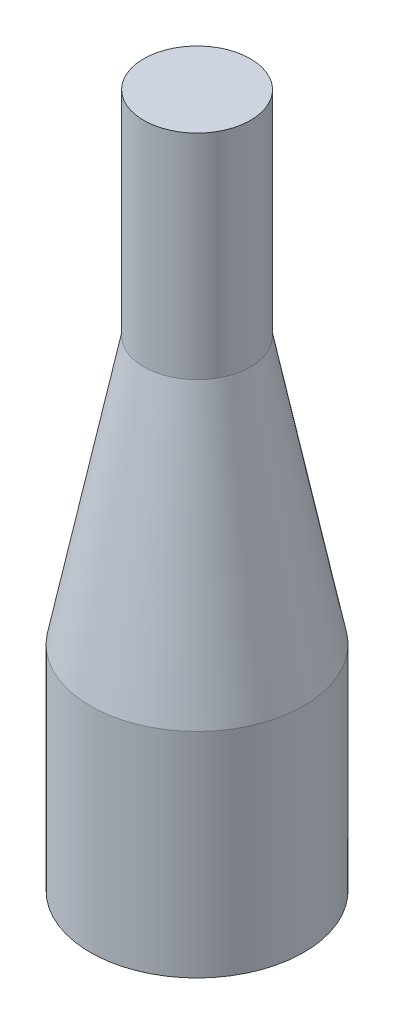
ISO-10303-21;
HEADER;
FILE_DESCRIPTION(('STEP AP214'),'2;1');
FILE_NAME('part.step','',(''),(''),'','','');
FILE_SCHEMA(('AUTOMOTIVE_DESIGN { 1 0 10303 214 1 1 1 1 }'));
ENDSEC;
DATA;
#1=APPLICATION_CONTEXT('core data for automotive mechanical design processes');
#2=APPLICATION_PROTOCOL_DEFINITION('international standard','automotive_design',2000,#1);
#3=PRODUCT_CONTEXT('',#1,'mechanical');
#4=PRODUCT('Part','Part','',(#3));
#5=PRODUCT_RELATED_PRODUCT_CATEGORY('part','',(#4));
#6=PRODUCT_DEFINITION_FORMATION('','',#4);
#7=PRODUCT_DEFINITION_CONTEXT('part definition',#1,'design');
#8=PRODUCT_DEFINITION('design','',#6,#7);
#9=PRODUCT_DEFINITION_SHAPE('','',#8);
#10=(LENGTH_UNIT() NAMED_UNIT(*) SI_UNIT(.MILLI.,.METRE.));
#11=(NAMED_UNIT(*) PLANE_ANGLE_UNIT() SI_UNIT($,.RADIAN.));
#12=(NAMED_UNIT(*) SI_UNIT($,.STERADIAN.) SOLID_ANGLE_UNIT());
#13=UNCERTAINTY_MEASURE_WITH_UNIT(LENGTH_MEASURE(1.E-05),#10,'distance_accuracy_value','');
#14=(GEOMETRIC_REPRESENTATION_CONTEXT(3) GLOBAL_UNCERTAINTY_ASSIGNED_CONTEXT((#13)) GLOBAL_UNIT_ASSIGNED_CONTEXT((#10,
#11,#12)) REPRESENTATION_CONTEXT('',''));
#15=CARTESIAN_POINT('',(0.,0.,0.));
#16=DIRECTION('',(0.,0.,1.));
#17=DIRECTION('',(1.,0.,0.));
#18=AXIS2_PLACEMENT_3D('',#15,#16,#17);
#19=CARTESIAN_POINT('',(0.,0.,0.));
#20=DIRECTION('',(0.,-1.,0.));
#21=DIRECTION('',(0.,0.,-1.));
#22=AXIS2_PLACEMENT_3D('',#19,#20,#21);
#23=PLANE('',#22);
#24=CARTESIAN_POINT('',(-50.8,0.,0.));
#25=DIRECTION('',(0.,-1.,0.));
#26=DIRECTION('',(0.,0.,-1.));
#27=AXIS2_PLACEMENT_3D('',#24,#25,#26);
#28=CIRCLE('',#27,50.8);
#29=CARTESIAN_POINT('',(-50.8,0.,-50.8));
#30=VERTEX_POINT('',#29);
#31=EDGE_CURVE('E51',#30,#30,#28,.T.);
#32=ORIENTED_EDGE('',*,*,#31,.T.);
#33=EDGE_LOOP('',(#32));
#34=FACE_BOUND('',#33,.T.);
#35=ADVANCED_FACE('F37',(#34),#23,.T.);
#36=CARTESIAN_POINT('',(-50.8,330.2,0.));
#37=DIRECTION('',(0.,1.,0.));
#38=DIRECTION('',(0.,0.,1.));
#39=AXIS2_PLACEMENT_3D('',#36,#37,#38);
#40=PLANE('',#39);
#41=CARTESIAN_POINT('',(-50.8,330.2,0.));
#42=DIRECTION('',(0.,-1.,0.));
#43=DIRECTION('',(0.,0.,-1.));
#44=AXIS2_PLACEMENT_3D('',#41,#42,#43);
#45=CIRCLE('',#44,25.4);
#46=CARTESIAN_POINT('',(-50.8,330.2,-25.4));
#47=VERTEX_POINT('',#46);
#48=EDGE_CURVE('E10',#47,#47,#45,.T.);
#49=ORIENTED_EDGE('',*,*,#48,.F.);
#50=EDGE_LOOP('',(#49));
#51=FACE_BOUND('',#50,.T.);
#52=ADVANCED_FACE('F69',(#51),#40,.T.);
#53=CARTESIAN_POINT('',(-50.8,0.,0.));
#54=DIRECTION('',(0.,-1.,0.));
#55=DIRECTION('',(0.,0.,-1.));
#56=AXIS2_PLACEMENT_3D('',#53,#54,#55);
#57=CYLINDRICAL_SURFACE('',#56,25.4);
#58=ORIENTED_EDGE('',*,*,#48,.T.);
#59=EDGE_LOOP('',(#58));
#60=FACE_BOUND('',#59,.T.);
#61=CARTESIAN_POINT('',(-50.8,228.6,0.));
#62=DIRECTION('',(0.,-1.,0.));
#63=DIRECTION('',(0.,0.,-1.));
#64=AXIS2_PLACEMENT_3D('',#61,#62,#63);
#65=CIRCLE('',#64,25.4);
#66=CARTESIAN_POINT('',(-50.8,228.6,-25.4));
#67=VERTEX_POINT('',#66);
#68=EDGE_CURVE('E43',#67,#67,#65,.T.);
#69=ORIENTED_EDGE('',*,*,#68,.F.);
#70=EDGE_LOOP('',(#69));
#71=FACE_BOUND('',#70,.T.);
#72=ADVANCED_FACE('F66',(#60,#71),#57,.T.);
#73=CARTESIAN_POINT('',(-50.8,101.6,0.));
#74=DIRECTION('',(0.,-1.,0.));
#75=DIRECTION('',(0.,0.,-1.));
#76=AXIS2_PLACEMENT_3D('',#73,#74,#75);
#77=CONICAL_SURFACE('',#76,50.8,0.197395559849881);
#78=ORIENTED_EDGE('',*,*,#68,.T.);
#79=EDGE_LOOP('',(#78));
#80=FACE_BOUND('',#79,.T.);
#81=CARTESIAN_POINT('',(-50.8,101.6,0.));
#82=DIRECTION('',(0.,-1.,0.));
#83=DIRECTION('',(0.,0.,-1.));
#84=AXIS2_PLACEMENT_3D('',#81,#82,#83);
#85=CIRCLE('',#84,50.8);
#86=CARTESIAN_POINT('',(-50.8,101.6,-50.8));
#87=VERTEX_POINT('',#86);
#88=EDGE_CURVE('E47',#87,#87,#85,.T.);
#89=ORIENTED_EDGE('',*,*,#88,.F.);
#90=EDGE_LOOP('',(#89));
#91=FACE_BOUND('',#90,.T.);
#92=ADVANCED_FACE('F60',(#80,#91),#77,.T.);
#93=CARTESIAN_POINT('',(-50.8,0.,0.));
#94=DIRECTION('',(0.,-1.,0.));
#95=DIRECTION('',(0.,0.,-1.));
#96=AXIS2_PLACEMENT_3D('',#93,#94,#95);
#97=CYLINDRICAL_SURFACE('',#96,50.8);
#98=ORIENTED_EDGE('',*,*,#88,.T.);
#99=EDGE_LOOP('',(#98));
#100=FACE_BOUND('',#99,.T.);
#101=ORIENTED_EDGE('',*,*,#31,.F.);
#102=EDGE_LOOP('',(#101));
#103=FACE_BOUND('',#102,.T.);
#104=ADVANCED_FACE('F58',(#100,#103),#97,.T.);
#105=CLOSED_SHELL('',(#35,#52,#72,#92,#104));
#106=MANIFOLD_SOLID_BREP('B2',#105);
#107=ADVANCED_BREP_SHAPE_REPRESENTATION('',(#18,#106),#14);
#108=SHAPE_DEFINITION_REPRESENTATION(#9,#107);
ENDSEC;
END-ISO-10303-21;
